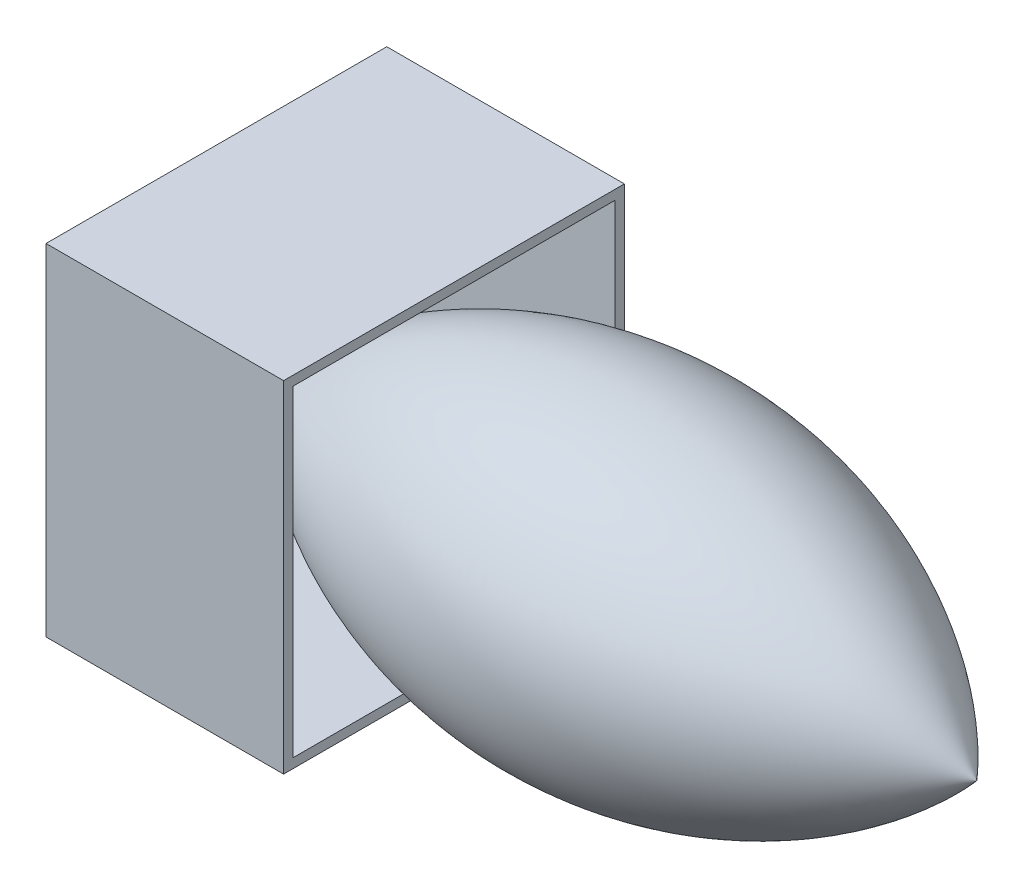
ISO-10303-21;
HEADER;
FILE_DESCRIPTION(('STEP AP214'),'2;1');
FILE_NAME('part.step','',(''),(''),'','','');
FILE_SCHEMA(('AUTOMOTIVE_DESIGN { 1 0 10303 214 1 1 1 1 }'));
ENDSEC;
DATA;
#1=APPLICATION_CONTEXT('core data for automotive mechanical design processes');
#2=APPLICATION_PROTOCOL_DEFINITION('international standard','automotive_design',2000,#1);
#3=PRODUCT_CONTEXT('',#1,'mechanical');
#4=PRODUCT('Part','Part','',(#3));
#5=PRODUCT_RELATED_PRODUCT_CATEGORY('part','',(#4));
#6=PRODUCT_DEFINITION_FORMATION('','',#4);
#7=PRODUCT_DEFINITION_CONTEXT('part definition',#1,'design');
#8=PRODUCT_DEFINITION('design','',#6,#7);
#9=PRODUCT_DEFINITION_SHAPE('','',#8);
#10=(LENGTH_UNIT() NAMED_UNIT(*) SI_UNIT(.MILLI.,.METRE.));
#11=(NAMED_UNIT(*) PLANE_ANGLE_UNIT() SI_UNIT($,.RADIAN.));
#12=(NAMED_UNIT(*) SI_UNIT($,.STERADIAN.) SOLID_ANGLE_UNIT());
#13=UNCERTAINTY_MEASURE_WITH_UNIT(LENGTH_MEASURE(1.E-05),#10,'distance_accuracy_value','');
#14=(GEOMETRIC_REPRESENTATION_CONTEXT(3) GLOBAL_UNCERTAINTY_ASSIGNED_CONTEXT((#13)) GLOBAL_UNIT_ASSIGNED_CONTEXT((#10,
#11,#12)) REPRESENTATION_CONTEXT('',''));
#15=CARTESIAN_POINT('',(0.,0.,0.));
#16=DIRECTION('',(0.,0.,1.));
#17=DIRECTION('',(1.,0.,0.));
#18=AXIS2_PLACEMENT_3D('',#15,#16,#17);
#19=CARTESIAN_POINT('',(-0.1,-0.358562172233852,0.358562172233852));
#20=DIRECTION('',(0.,0.,1.));
#21=DIRECTION('',(1.,0.,0.));
#22=AXIS2_PLACEMENT_3D('',#19,#20,#21);
#23=PLANE('',#22);
#24=DIRECTION('',(1.,0.,0.));
#25=VECTOR('',#24,1.);
#26=CARTESIAN_POINT('',(-0.1,-0.358562172233852,0.358562172233852));
#27=LINE('',#26,#25);
#28=CARTESIAN_POINT('',(-0.1,-0.358562172233852,0.358562172233852));
#29=VERTEX_POINT('',#28);
#30=CARTESIAN_POINT('',(0.4,-0.358562172233852,0.358562172233852));
#31=VERTEX_POINT('',#30);
#32=EDGE_CURVE('E44',#29,#31,#27,.T.);
#33=ORIENTED_EDGE('',*,*,#32,.T.);
#34=DIRECTION('',(0.,-1.,0.));
#35=VECTOR('',#34,1.);
#36=CARTESIAN_POINT('',(0.4,-0.358562172233852,0.358562172233852));
#37=LINE('',#36,#35);
#38=CARTESIAN_POINT('',(0.4,0.358562172233852,0.358562172233852));
#39=VERTEX_POINT('',#38);
#40=EDGE_CURVE('E136',#39,#31,#37,.T.);
#41=ORIENTED_EDGE('',*,*,#40,.F.);
#42=DIRECTION('',(1.,0.,0.));
#43=VECTOR('',#42,1.);
#44=CARTESIAN_POINT('',(-0.1,0.358562172233852,0.358562172233852));
#45=LINE('',#44,#43);
#46=CARTESIAN_POINT('',(-0.1,0.358562172233852,0.358562172233852));
#47=VERTEX_POINT('',#46);
#48=EDGE_CURVE('E12',#47,#39,#45,.T.);
#49=ORIENTED_EDGE('',*,*,#48,.F.);
#50=DIRECTION('',(0.,-1.,0.));
#51=VECTOR('',#50,1.);
#52=CARTESIAN_POINT('',(-0.1,-0.358562172233852,0.358562172233852));
#53=LINE('',#52,#51);
#54=EDGE_CURVE('E155',#47,#29,#53,.T.);
#55=ORIENTED_EDGE('',*,*,#54,.T.);
#56=EDGE_LOOP('',(#33,#41,#49,#55));
#57=FACE_BOUND('',#56,.T.);
#58=ADVANCED_FACE('F41',(#57),#23,.T.);
#59=CARTESIAN_POINT('',(-0.1,0.358562172233852,0.358562172233852));
#60=DIRECTION('',(0.,1.,0.));
#61=DIRECTION('',(0.,0.,1.));
#62=AXIS2_PLACEMENT_3D('',#59,#60,#61);
#63=PLANE('',#62);
#64=ORIENTED_EDGE('',*,*,#48,.T.);
#65=DIRECTION('',(0.,0.,1.));
#66=VECTOR('',#65,1.);
#67=CARTESIAN_POINT('',(0.4,0.358562172233852,0.358562172233852));
#68=LINE('',#67,#66);
#69=CARTESIAN_POINT('',(0.4,0.358562172233852,-0.358562172233852));
#70=VERTEX_POINT('',#69);
#71=EDGE_CURVE('E145',#70,#39,#68,.T.);
#72=ORIENTED_EDGE('',*,*,#71,.F.);
#73=DIRECTION('',(1.,0.,0.));
#74=VECTOR('',#73,1.);
#75=CARTESIAN_POINT('',(-0.1,0.358562172233852,-0.358562172233852));
#76=LINE('',#75,#74);
#77=CARTESIAN_POINT('',(-0.1,0.358562172233852,-0.358562172233852));
#78=VERTEX_POINT('',#77);
#79=EDGE_CURVE('E49',#78,#70,#76,.T.);
#80=ORIENTED_EDGE('',*,*,#79,.F.);
#81=DIRECTION('',(0.,0.,1.));
#82=VECTOR('',#81,1.);
#83=CARTESIAN_POINT('',(-0.1,0.358562172233852,0.358562172233852));
#84=LINE('',#83,#82);
#85=EDGE_CURVE('E166',#78,#47,#84,.T.);
#86=ORIENTED_EDGE('',*,*,#85,.T.);
#87=EDGE_LOOP('',(#64,#72,#80,#86));
#88=FACE_BOUND('',#87,.T.);
#89=ADVANCED_FACE('F178',(#88),#63,.T.);
#90=CARTESIAN_POINT('',(-0.1,-0.358562172233852,-0.358562172233852));
#91=DIRECTION('',(0.,0.,-1.));
#92=DIRECTION('',(0.,1.,0.));
#93=AXIS2_PLACEMENT_3D('',#90,#91,#92);
#94=PLANE('',#93);
#95=ORIENTED_EDGE('',*,*,#79,.T.);
#96=DIRECTION('',(0.,1.,0.));
#97=VECTOR('',#96,1.);
#98=CARTESIAN_POINT('',(0.4,-0.358562172233852,-0.358562172233852));
#99=LINE('',#98,#97);
#100=CARTESIAN_POINT('',(0.4,-0.358562172233852,-0.358562172233852));
#101=VERTEX_POINT('',#100);
#102=EDGE_CURVE('E142',#101,#70,#99,.T.);
#103=ORIENTED_EDGE('',*,*,#102,.F.);
#104=DIRECTION('',(1.,0.,0.));
#105=VECTOR('',#104,1.);
#106=CARTESIAN_POINT('',(-0.1,-0.358562172233852,-0.358562172233852));
#107=LINE('',#106,#105);
#108=CARTESIAN_POINT('',(-0.1,-0.358562172233852,-0.358562172233852));
#109=VERTEX_POINT('',#108);
#110=EDGE_CURVE('E169',#109,#101,#107,.T.);
#111=ORIENTED_EDGE('',*,*,#110,.F.);
#112=DIRECTION('',(0.,1.,0.));
#113=VECTOR('',#112,1.);
#114=CARTESIAN_POINT('',(-0.1,-0.358562172233852,-0.358562172233852));
#115=LINE('',#114,#113);
#116=EDGE_CURVE('E163',#109,#78,#115,.T.);
#117=ORIENTED_EDGE('',*,*,#116,.T.);
#118=EDGE_LOOP('',(#95,#103,#111,#117));
#119=FACE_BOUND('',#118,.T.);
#120=ADVANCED_FACE('F184',(#119),#94,.T.);
#121=CARTESIAN_POINT('',(-0.1,-0.358562172233852,0.358562172233852));
#122=DIRECTION('',(0.,-1.,0.));
#123=DIRECTION('',(0.,0.,-1.));
#124=AXIS2_PLACEMENT_3D('',#121,#122,#123);
#125=PLANE('',#124);
#126=ORIENTED_EDGE('',*,*,#110,.T.);
#127=DIRECTION('',(0.,0.,-1.));
#128=VECTOR('',#127,1.);
#129=CARTESIAN_POINT('',(0.4,-0.358562172233852,0.358562172233852));
#130=LINE('',#129,#128);
#131=EDGE_CURVE('E139',#31,#101,#130,.T.);
#132=ORIENTED_EDGE('',*,*,#131,.F.);
#133=ORIENTED_EDGE('',*,*,#32,.F.);
#134=DIRECTION('',(0.,0.,-1.));
#135=VECTOR('',#134,1.);
#136=CARTESIAN_POINT('',(-0.1,-0.358562172233852,0.358562172233852));
#137=LINE('',#136,#135);
#138=EDGE_CURVE('E160',#29,#109,#137,.T.);
#139=ORIENTED_EDGE('',*,*,#138,.T.);
#140=EDGE_LOOP('',(#126,#132,#133,#139));
#141=FACE_BOUND('',#140,.T.);
#142=ADVANCED_FACE('F173',(#141),#125,.T.);
#143=CARTESIAN_POINT('',(-0.1,0.,0.));
#144=DIRECTION('',(-1.,0.,0.));
#145=DIRECTION('',(0.,0.,1.));
#146=AXIS2_PLACEMENT_3D('',#143,#144,#145);
#147=PLANE('',#146);
#148=DIRECTION('',(0.,1.,0.));
#149=VECTOR('',#148,1.);
#150=CARTESIAN_POINT('',(-0.1,-0.338562172233852,-0.338562172233852));
#151=LINE('',#150,#149);
#152=CARTESIAN_POINT('',(-0.1,-0.338562172233852,-0.338562172233852));
#153=VERTEX_POINT('',#152);
#154=CARTESIAN_POINT('',(-0.1,0.338562172233852,-0.338562172233852));
#155=VERTEX_POINT('',#154);
#156=EDGE_CURVE('E148',#153,#155,#151,.T.);
#157=ORIENTED_EDGE('',*,*,#156,.T.);
#158=DIRECTION('',(0.,0.,1.));
#159=VECTOR('',#158,1.);
#160=CARTESIAN_POINT('',(-0.1,0.338562172233852,0.338562172233852));
#161=LINE('',#160,#159);
#162=CARTESIAN_POINT('',(-0.1,0.338562172233852,0.338562172233852));
#163=VERTEX_POINT('',#162);
#164=EDGE_CURVE('E113',#155,#163,#161,.T.);
#165=ORIENTED_EDGE('',*,*,#164,.T.);
#166=DIRECTION('',(0.,-1.,0.));
#167=VECTOR('',#166,1.);
#168=CARTESIAN_POINT('',(-0.1,-0.338562172233852,0.338562172233852));
#169=LINE('',#168,#167);
#170=CARTESIAN_POINT('',(-0.1,-0.338562172233852,0.338562172233852));
#171=VERTEX_POINT('',#170);
#172=EDGE_CURVE('E57',#163,#171,#169,.T.);
#173=ORIENTED_EDGE('',*,*,#172,.T.);
#174=DIRECTION('',(0.,0.,-1.));
#175=VECTOR('',#174,1.);
#176=CARTESIAN_POINT('',(-0.1,-0.338562172233852,0.338562172233852));
#177=LINE('',#176,#175);
#178=EDGE_CURVE('E118',#171,#153,#177,.T.);
#179=ORIENTED_EDGE('',*,*,#178,.T.);
#180=EDGE_LOOP('',(#157,#165,#173,#179));
#181=FACE_BOUND('',#180,.T.);
#182=ORIENTED_EDGE('',*,*,#54,.F.);
#183=ORIENTED_EDGE('',*,*,#85,.F.);
#184=ORIENTED_EDGE('',*,*,#116,.F.);
#185=ORIENTED_EDGE('',*,*,#138,.F.);
#186=EDGE_LOOP('',(#182,#183,#184,#185));
#187=FACE_BOUND('',#186,.T.);
#188=ADVANCED_FACE('F182',(#181,#187),#147,.T.);
#189=CARTESIAN_POINT('',(-0.1,-0.338562172233852,-0.338562172233852));
#190=DIRECTION('',(0.,0.,-1.));
#191=DIRECTION('',(-1.,0.,0.));
#192=AXIS2_PLACEMENT_3D('',#189,#190,#191);
#193=PLANE('',#192);
#194=DIRECTION('',(1.,0.,0.));
#195=VECTOR('',#194,1.);
#196=CARTESIAN_POINT('',(-0.1,-0.338562172233852,-0.338562172233852));
#197=LINE('',#196,#195);
#198=CARTESIAN_POINT('',(0.4,-0.338562172233852,-0.338562172233852));
#199=VERTEX_POINT('',#198);
#200=EDGE_CURVE('E123',#153,#199,#197,.T.);
#201=ORIENTED_EDGE('',*,*,#200,.T.);
#202=DIRECTION('',(0.,1.,0.));
#203=VECTOR('',#202,1.);
#204=CARTESIAN_POINT('',(0.4,-0.338562172233852,-0.338562172233852));
#205=LINE('',#204,#203);
#206=CARTESIAN_POINT('',(0.4,0.338562172233852,-0.338562172233852));
#207=VERTEX_POINT('',#206);
#208=EDGE_CURVE('E121',#199,#207,#205,.T.);
#209=ORIENTED_EDGE('',*,*,#208,.T.);
#210=DIRECTION('',(1.,0.,0.));
#211=VECTOR('',#210,1.);
#212=CARTESIAN_POINT('',(-0.1,0.338562172233852,-0.338562172233852));
#213=LINE('',#212,#211);
#214=EDGE_CURVE('E106',#155,#207,#213,.T.);
#215=ORIENTED_EDGE('',*,*,#214,.F.);
#216=ORIENTED_EDGE('',*,*,#156,.F.);
#217=EDGE_LOOP('',(#201,#209,#215,#216));
#218=FACE_BOUND('',#217,.T.);
#219=ADVANCED_FACE('F122',(#218),#193,.F.);
#220=CARTESIAN_POINT('',(-0.1,-0.338562172233852,0.338562172233852));
#221=DIRECTION('',(0.,-1.,0.));
#222=DIRECTION('',(0.,0.,-1.));
#223=AXIS2_PLACEMENT_3D('',#220,#221,#222);
#224=PLANE('',#223);
#225=DIRECTION('',(1.,0.,0.));
#226=VECTOR('',#225,1.);
#227=CARTESIAN_POINT('',(-0.1,-0.338562172233852,0.338562172233852));
#228=LINE('',#227,#226);
#229=CARTESIAN_POINT('',(0.4,-0.338562172233852,0.338562172233852));
#230=VERTEX_POINT('',#229);
#231=EDGE_CURVE('E156',#171,#230,#228,.T.);
#232=ORIENTED_EDGE('',*,*,#231,.T.);
#233=DIRECTION('',(0.,0.,-1.));
#234=VECTOR('',#233,1.);
#235=CARTESIAN_POINT('',(0.4,-0.338562172233852,0.338562172233852));
#236=LINE('',#235,#234);
#237=EDGE_CURVE('E132',#230,#199,#236,.T.);
#238=ORIENTED_EDGE('',*,*,#237,.T.);
#239=ORIENTED_EDGE('',*,*,#200,.F.);
#240=ORIENTED_EDGE('',*,*,#178,.F.);
#241=EDGE_LOOP('',(#232,#238,#239,#240));
#242=FACE_BOUND('',#241,.T.);
#243=ADVANCED_FACE('F227',(#242),#224,.F.);
#244=CARTESIAN_POINT('',(-0.1,-0.338562172233852,0.338562172233852));
#245=DIRECTION('',(0.,0.,1.));
#246=DIRECTION('',(1.,0.,0.));
#247=AXIS2_PLACEMENT_3D('',#244,#245,#246);
#248=PLANE('',#247);
#249=DIRECTION('',(1.,0.,0.));
#250=VECTOR('',#249,1.);
#251=CARTESIAN_POINT('',(-0.1,0.338562172233852,0.338562172233852));
#252=LINE('',#251,#250);
#253=CARTESIAN_POINT('',(0.4,0.338562172233852,0.338562172233852));
#254=VERTEX_POINT('',#253);
#255=EDGE_CURVE('E117',#163,#254,#252,.T.);
#256=ORIENTED_EDGE('',*,*,#255,.T.);
#257=DIRECTION('',(0.,-1.,0.));
#258=VECTOR('',#257,1.);
#259=CARTESIAN_POINT('',(0.4,-0.338562172233852,0.338562172233852));
#260=LINE('',#259,#258);
#261=EDGE_CURVE('E130',#254,#230,#260,.T.);
#262=ORIENTED_EDGE('',*,*,#261,.T.);
#263=ORIENTED_EDGE('',*,*,#231,.F.);
#264=ORIENTED_EDGE('',*,*,#172,.F.);
#265=EDGE_LOOP('',(#256,#262,#263,#264));
#266=FACE_BOUND('',#265,.T.);
#267=ADVANCED_FACE('F236',(#266),#248,.F.);
#268=CARTESIAN_POINT('',(-0.1,0.338562172233852,0.338562172233852));
#269=DIRECTION('',(0.,1.,0.));
#270=DIRECTION('',(0.,0.,1.));
#271=AXIS2_PLACEMENT_3D('',#268,#269,#270);
#272=PLANE('',#271);
#273=ORIENTED_EDGE('',*,*,#214,.T.);
#274=DIRECTION('',(0.,0.,1.));
#275=VECTOR('',#274,1.);
#276=CARTESIAN_POINT('',(0.4,0.338562172233852,0.338562172233852));
#277=LINE('',#276,#275);
#278=EDGE_CURVE('E110',#207,#254,#277,.T.);
#279=ORIENTED_EDGE('',*,*,#278,.T.);
#280=ORIENTED_EDGE('',*,*,#255,.F.);
#281=ORIENTED_EDGE('',*,*,#164,.F.);
#282=EDGE_LOOP('',(#273,#279,#280,#281));
#283=FACE_BOUND('',#282,.T.);
#284=ADVANCED_FACE('F108',(#283),#272,.F.);
#285=CARTESIAN_POINT('',(0.4,0.,0.));
#286=DIRECTION('',(-1.,0.,0.));
#287=DIRECTION('',(0.,0.,1.));
#288=AXIS2_PLACEMENT_3D('',#285,#286,#287);
#289=PLANE('',#288);
#290=ORIENTED_EDGE('',*,*,#40,.T.);
#291=ORIENTED_EDGE('',*,*,#131,.T.);
#292=ORIENTED_EDGE('',*,*,#102,.T.);
#293=ORIENTED_EDGE('',*,*,#71,.T.);
#294=EDGE_LOOP('',(#290,#291,#292,#293));
#295=FACE_BOUND('',#294,.T.);
#296=ORIENTED_EDGE('',*,*,#208,.F.);
#297=ORIENTED_EDGE('',*,*,#237,.F.);
#298=ORIENTED_EDGE('',*,*,#261,.F.);
#299=ORIENTED_EDGE('',*,*,#278,.F.);
#300=EDGE_LOOP('',(#296,#297,#298,#299));
#301=FACE_BOUND('',#300,.T.);
#302=ADVANCED_FACE('F128',(#295,#301),#289,.F.);
#303=CLOSED_SHELL('',(#58,#89,#120,#142,#188,#219,#243,#267,#284,#302));
#304=MANIFOLD_SOLID_BREP('B2',#303);
#305=CARTESIAN_POINT('',(0.75,0.,-0.661437827766148));
#306=DIRECTION('',(0.,-1.,0.));
#307=DIRECTION('',(0.,0.,1.));
#308=AXIS2_PLACEMENT_3D('',#305,#306,#307);
#309=CIRCLE('',#308,1.);
#310=TRIMMED_CURVE('',#309,(PARAMETER_VALUE(-0.848062078981481)),
(PARAMETER_VALUE(0.848062078981481)),.T.,.PARAMETER.);
#311=CARTESIAN_POINT('',(0.75,0.,0.));
#312=DIRECTION('',(-1.,0.,0.));
#313=AXIS1_PLACEMENT('',#311,#312);
#314=SURFACE_OF_REVOLUTION('',#310,#313);
#315=CARTESIAN_POINT('',(0.,0.,0.));
#316=VERTEX_POINT('',#315);
#317=VERTEX_LOOP('',#316);
#318=FACE_BOUND('',#317,.T.);
#319=CARTESIAN_POINT('',(1.5,0.,0.));
#320=VERTEX_POINT('',#319);
#321=VERTEX_LOOP('',#320);
#322=FACE_BOUND('',#321,.T.);
#323=ADVANCED_FACE('F271',(#318,#322),#314,.T.);
#324=CLOSED_SHELL('',(#323));
#325=MANIFOLD_SOLID_BREP('B6',#324);
#326=ADVANCED_BREP_SHAPE_REPRESENTATION('',(#18,#304,#325),#14);
#327=SHAPE_DEFINITION_REPRESENTATION(#9,#326);
ENDSEC;
END-ISO-10303-21;
